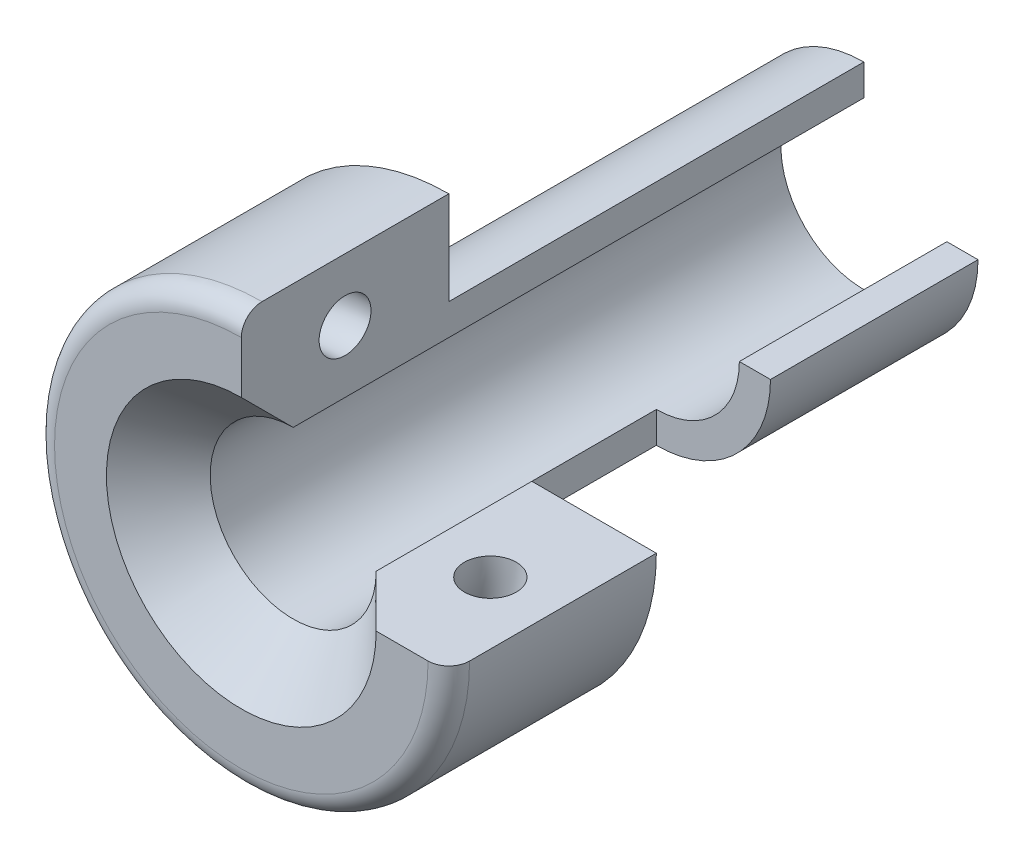
ISO-10303-21;
HEADER;
FILE_DESCRIPTION(('STEP AP214'),'2;1');
FILE_NAME('part.step','',(''),(''),'','','');
FILE_SCHEMA(('AUTOMOTIVE_DESIGN { 1 0 10303 214 1 1 1 1 }'));
ENDSEC;
DATA;
#1=APPLICATION_CONTEXT('core data for automotive mechanical design processes');
#2=APPLICATION_PROTOCOL_DEFINITION('international standard','automotive_design',2000,#1);
#3=PRODUCT_CONTEXT('',#1,'mechanical');
#4=PRODUCT('Part','Part','',(#3));
#5=PRODUCT_RELATED_PRODUCT_CATEGORY('part','',(#4));
#6=PRODUCT_DEFINITION_FORMATION('','',#4);
#7=PRODUCT_DEFINITION_CONTEXT('part definition',#1,'design');
#8=PRODUCT_DEFINITION('design','',#6,#7);
#9=PRODUCT_DEFINITION_SHAPE('','',#8);
#10=(LENGTH_UNIT() NAMED_UNIT(*) SI_UNIT(.MILLI.,.METRE.));
#11=(NAMED_UNIT(*) PLANE_ANGLE_UNIT() SI_UNIT($,.RADIAN.));
#12=(NAMED_UNIT(*) SI_UNIT($,.STERADIAN.) SOLID_ANGLE_UNIT());
#13=UNCERTAINTY_MEASURE_WITH_UNIT(LENGTH_MEASURE(1.E-05),#10,'distance_accuracy_value','');
#14=(GEOMETRIC_REPRESENTATION_CONTEXT(3) GLOBAL_UNCERTAINTY_ASSIGNED_CONTEXT((#13)) GLOBAL_UNIT_ASSIGNED_CONTEXT((#10,
#11,#12)) REPRESENTATION_CONTEXT('',''));
#15=CARTESIAN_POINT('',(0.,0.,0.));
#16=DIRECTION('',(0.,0.,1.));
#17=DIRECTION('',(1.,0.,0.));
#18=AXIS2_PLACEMENT_3D('',#15,#16,#17);
#19=CARTESIAN_POINT('',(0.,0.,-20.));
#20=DIRECTION('',(0.,0.,1.));
#21=DIRECTION('',(1.,0.,0.));
#22=AXIS2_PLACEMENT_3D('',#19,#20,#21);
#23=PLANE('',#22);
#24=CARTESIAN_POINT('',(0.,0.,-20.));
#25=DIRECTION('',(0.,0.,-1.));
#26=DIRECTION('',(-1.,0.,0.));
#27=AXIS2_PLACEMENT_3D('',#24,#25,#26);
#28=CIRCLE('',#27,11.);
#29=CARTESIAN_POINT('',(0.,-11.,-20.));
#30=VERTEX_POINT('',#29);
#31=CARTESIAN_POINT('',(0.,11.,-20.));
#32=VERTEX_POINT('',#31);
#33=EDGE_CURVE('E189',#30,#32,#28,.T.);
#34=ORIENTED_EDGE('',*,*,#33,.F.);
#35=DIRECTION('',(0.,1.,0.));
#36=VECTOR('',#35,1.);
#37=CARTESIAN_POINT('',(0.,0.,-20.));
#38=LINE('',#37,#36);
#39=CARTESIAN_POINT('',(0.,-8.,-20.));
#40=VERTEX_POINT('',#39);
#41=EDGE_CURVE('E184',#30,#40,#38,.T.);
#42=ORIENTED_EDGE('',*,*,#41,.T.);
#43=CARTESIAN_POINT('',(0.,0.,-20.));
#44=DIRECTION('',(0.,0.,-1.));
#45=DIRECTION('',(-1.,0.,0.));
#46=AXIS2_PLACEMENT_3D('',#43,#44,#45);
#47=CIRCLE('',#46,8.);
#48=CARTESIAN_POINT('',(8.,0.,-20.));
#49=VERTEX_POINT('',#48);
#50=EDGE_CURVE('E233',#49,#40,#47,.T.);
#51=ORIENTED_EDGE('',*,*,#50,.F.);
#52=DIRECTION('',(-1.,0.,0.));
#53=VECTOR('',#52,1.);
#54=CARTESIAN_POINT('',(0.,0.,-20.));
#55=LINE('',#54,#53);
#56=CARTESIAN_POINT('',(20.,2.09488880330588E-13,-20.));
#57=VERTEX_POINT('',#56);
#58=EDGE_CURVE('E224',#57,#49,#55,.T.);
#59=ORIENTED_EDGE('',*,*,#58,.F.);
#60=CARTESIAN_POINT('',(0.,0.,-20.));
#61=DIRECTION('',(0.,0.,-1.));
#62=DIRECTION('',(-1.,0.,0.));
#63=AXIS2_PLACEMENT_3D('',#60,#61,#62);
#64=CIRCLE('',#63,20.);
#65=CARTESIAN_POINT('',(0.,20.,-20.));
#66=VERTEX_POINT('',#65);
#67=EDGE_CURVE('E228',#57,#66,#64,.T.);
#68=ORIENTED_EDGE('',*,*,#67,.T.);
#69=DIRECTION('',(0.,-1.,0.));
#70=VECTOR('',#69,1.);
#71=CARTESIAN_POINT('',(0.,0.,-20.));
#72=LINE('',#71,#70);
#73=EDGE_CURVE('E206',#66,#32,#72,.T.);
#74=ORIENTED_EDGE('',*,*,#73,.T.);
#75=EDGE_LOOP('',(#34,#42,#51,#59,#68,#74));
#76=FACE_BOUND('',#75,.T.);
#77=ADVANCED_FACE('F48',(#76),#23,.F.);
#78=CARTESIAN_POINT('',(0.,0.,0.));
#79=DIRECTION('',(0.,0.,-1.));
#80=DIRECTION('',(-1.,0.,0.));
#81=AXIS2_PLACEMENT_3D('',#78,#79,#80);
#82=PLANE('',#81);
#83=DIRECTION('',(0.,1.,0.));
#84=VECTOR('',#83,1.);
#85=CARTESIAN_POINT('',(0.,0.,0.));
#86=LINE('',#85,#84);
#87=CARTESIAN_POINT('',(0.,13.,0.));
#88=VERTEX_POINT('',#87);
#89=CARTESIAN_POINT('',(0.,18.,0.));
#90=VERTEX_POINT('',#89);
#91=EDGE_CURVE('E199',#88,#90,#86,.T.);
#92=ORIENTED_EDGE('',*,*,#91,.T.);
#93=CARTESIAN_POINT('',(0.,0.,0.));
#94=DIRECTION('',(0.,0.,-1.));
#95=DIRECTION('',(-1.,0.,0.));
#96=AXIS2_PLACEMENT_3D('',#93,#94,#95);
#97=CIRCLE('',#96,18.);
#98=CARTESIAN_POINT('',(18.,1.88539992297529E-13,0.));
#99=VERTEX_POINT('',#98);
#100=EDGE_CURVE('E60',#90,#99,#97,.F.);
#101=ORIENTED_EDGE('',*,*,#100,.T.);
#102=DIRECTION('',(1.,0.,0.));
#103=VECTOR('',#102,1.);
#104=CARTESIAN_POINT('',(0.,0.,0.));
#105=LINE('',#104,#103);
#106=CARTESIAN_POINT('',(13.,1.36167772214882E-13,0.));
#107=VERTEX_POINT('',#106);
#108=EDGE_CURVE('E220',#107,#99,#105,.T.);
#109=ORIENTED_EDGE('',*,*,#108,.F.);
#110=CARTESIAN_POINT('',(0.,0.,0.));
#111=DIRECTION('',(0.,0.,-1.));
#112=DIRECTION('',(-1.,0.,0.));
#113=AXIS2_PLACEMENT_3D('',#110,#111,#112);
#114=CIRCLE('',#113,13.);
#115=EDGE_CURVE('E238',#107,#88,#114,.T.);
#116=ORIENTED_EDGE('',*,*,#115,.T.);
#117=EDGE_LOOP('',(#92,#101,#109,#116));
#118=FACE_BOUND('',#117,.T.);
#119=ADVANCED_FACE('F302',(#118),#82,.F.);
#120=CARTESIAN_POINT('',(0.,0.,0.));
#121=DIRECTION('',(0.,0.,-1.));
#122=DIRECTION('',(-1.,0.,0.));
#123=AXIS2_PLACEMENT_3D('',#120,#121,#122);
#124=CYLINDRICAL_SURFACE('',#123,8.);
#125=DIRECTION('',(0.,0.,-1.));
#126=VECTOR('',#125,1.);
#127=CARTESIAN_POINT('',(0.,8.,0.));
#128=LINE('',#127,#126);
#129=CARTESIAN_POINT('',(0.,8.,-5.00000000000001));
#130=VERTEX_POINT('',#129);
#131=CARTESIAN_POINT('',(0.,8.,-60.));
#132=VERTEX_POINT('',#131);
#133=EDGE_CURVE('E201',#130,#132,#128,.T.);
#134=ORIENTED_EDGE('',*,*,#133,.F.);
#135=CARTESIAN_POINT('',(0.,0.,-5.00000000000001));
#136=DIRECTION('',(0.,0.,-1.));
#137=DIRECTION('',(-1.,0.,0.));
#138=AXIS2_PLACEMENT_3D('',#135,#136,#137);
#139=CIRCLE('',#138,8.);
#140=CARTESIAN_POINT('',(8.,0.,-5.00000000000001));
#141=VERTEX_POINT('',#140);
#142=EDGE_CURVE('E249',#130,#141,#139,.F.);
#143=ORIENTED_EDGE('',*,*,#142,.T.);
#144=DIRECTION('',(0.,0.,-1.));
#145=VECTOR('',#144,1.);
#146=CARTESIAN_POINT('',(8.,0.,0.));
#147=LINE('',#146,#145);
#148=EDGE_CURVE('E219',#141,#49,#147,.T.);
#149=ORIENTED_EDGE('',*,*,#148,.T.);
#150=ORIENTED_EDGE('',*,*,#50,.T.);
#151=DIRECTION('',(0.,0.,-1.));
#152=VECTOR('',#151,1.);
#153=CARTESIAN_POINT('',(0.,-8.,0.));
#154=LINE('',#153,#152);
#155=CARTESIAN_POINT('',(0.,-8.,-40.));
#156=VERTEX_POINT('',#155);
#157=EDGE_CURVE('E177',#40,#156,#154,.T.);
#158=ORIENTED_EDGE('',*,*,#157,.T.);
#159=CARTESIAN_POINT('',(0.,0.,-40.));
#160=DIRECTION('',(0.,0.,-1.));
#161=DIRECTION('',(-1.,0.,0.));
#162=AXIS2_PLACEMENT_3D('',#159,#160,#161);
#163=CIRCLE('',#162,8.);
#164=CARTESIAN_POINT('',(8.,0.,-40.));
#165=VERTEX_POINT('',#164);
#166=EDGE_CURVE('E145',#165,#156,#163,.T.);
#167=ORIENTED_EDGE('',*,*,#166,.F.);
#168=DIRECTION('',(0.,0.,-1.));
#169=VECTOR('',#168,1.);
#170=CARTESIAN_POINT('',(8.,0.,0.));
#171=LINE('',#170,#169);
#172=CARTESIAN_POINT('',(8.,0.,-60.));
#173=VERTEX_POINT('',#172);
#174=EDGE_CURVE('E157',#165,#173,#171,.T.);
#175=ORIENTED_EDGE('',*,*,#174,.T.);
#176=CARTESIAN_POINT('',(0.,0.,-60.));
#177=DIRECTION('',(0.,0.,-1.));
#178=DIRECTION('',(-1.,0.,0.));
#179=AXIS2_PLACEMENT_3D('',#176,#177,#178);
#180=CIRCLE('',#179,8.);
#181=EDGE_CURVE('E194',#173,#132,#180,.T.);
#182=ORIENTED_EDGE('',*,*,#181,.T.);
#183=EDGE_LOOP('',(#134,#143,#149,#150,#158,#167,#175,#182));
#184=FACE_BOUND('',#183,.T.);
#185=ADVANCED_FACE('F294',(#184),#124,.F.);
#186=CARTESIAN_POINT('',(0.,0.,-10.));
#187=DIRECTION('',(0.,0.,-1.));
#188=DIRECTION('',(-1.,0.,0.));
#189=AXIS2_PLACEMENT_3D('',#186,#187,#188);
#190=TOROIDAL_SURFACE('',#189,14.,2.5);
#191=CARTESIAN_POINT('',(14.,1.46642216231412E-13,-10.));
#192=DIRECTION('',(0.,-1.,0.));
#193=DIRECTION('',(0.,0.,-1.));
#194=AXIS2_PLACEMENT_3D('',#191,#192,#193);
#195=CIRCLE('',#194,2.5);
#196=CARTESIAN_POINT('',(16.5,1.72828326272735E-13,-10.));
#197=VERTEX_POINT('',#196);
#198=EDGE_CURVE('E213',#197,#197,#195,.T.);
#199=CARTESIAN_POINT('',(0.,14.,-10.));
#200=DIRECTION('',(1.,0.,0.));
#201=DIRECTION('',(0.,0.,-1.));
#202=AXIS2_PLACEMENT_3D('',#199,#200,#201);
#203=CIRCLE('',#202,2.5);
#204=CARTESIAN_POINT('',(0.,16.5,-10.));
#205=VERTEX_POINT('',#204);
#206=EDGE_CURVE('E198',#205,#205,#203,.T.);
#207=CARTESIAN_POINT('',(0.,0.,-10.));
#208=DIRECTION('',(0.,0.,-1.));
#209=DIRECTION('',(-1.,0.,0.));
#210=AXIS2_PLACEMENT_3D('',#207,#208,#209);
#211=CIRCLE('',#210,16.5);
#212=EDGE_CURVE('',#197,#205,#211,.T.);
#213=ORIENTED_EDGE('',*,*,#198,.F.);
#214=ORIENTED_EDGE('',*,*,#206,.T.);
#215=ORIENTED_EDGE('',*,*,#212,.T.);
#216=ORIENTED_EDGE('',*,*,#212,.F.);
#217=EDGE_LOOP('',(#213,#215,#214,#216));
#218=FACE_BOUND('',#217,.T.);
#219=ADVANCED_FACE('F326',(#218),#190,.F.);
#220=CARTESIAN_POINT('',(0.,0.,0.));
#221=DIRECTION('',(0.,0.,-1.));
#222=DIRECTION('',(-1.,0.,0.));
#223=AXIS2_PLACEMENT_3D('',#220,#221,#222);
#224=CYLINDRICAL_SURFACE('',#223,20.);
#225=DIRECTION('',(0.,0.,-1.));
#226=VECTOR('',#225,1.);
#227=CARTESIAN_POINT('',(20.,2.09488880330588E-13,0.));
#228=LINE('',#227,#226);
#229=CARTESIAN_POINT('',(20.,2.09488880330588E-13,-2.));
#230=VERTEX_POINT('',#229);
#231=EDGE_CURVE('E229',#230,#57,#228,.T.);
#232=ORIENTED_EDGE('',*,*,#231,.F.);
#233=CARTESIAN_POINT('',(0.,0.,-2.));
#234=DIRECTION('',(0.,0.,-1.));
#235=DIRECTION('',(-1.,0.,0.));
#236=AXIS2_PLACEMENT_3D('',#233,#234,#235);
#237=CIRCLE('',#236,20.);
#238=CARTESIAN_POINT('',(0.,20.,-2.));
#239=VERTEX_POINT('',#238);
#240=EDGE_CURVE('E251',#230,#239,#237,.T.);
#241=ORIENTED_EDGE('',*,*,#240,.T.);
#242=DIRECTION('',(0.,0.,-1.));
#243=VECTOR('',#242,1.);
#244=CARTESIAN_POINT('',(0.,20.,0.));
#245=LINE('',#244,#243);
#246=EDGE_CURVE('E209',#239,#66,#245,.T.);
#247=ORIENTED_EDGE('',*,*,#246,.T.);
#248=ORIENTED_EDGE('',*,*,#67,.F.);
#249=EDGE_LOOP('',(#232,#241,#247,#248));
#250=FACE_BOUND('',#249,.T.);
#251=ADVANCED_FACE('F280',(#250),#224,.T.);
#252=CARTESIAN_POINT('',(0.,0.,0.));
#253=DIRECTION('',(0.,-1.,0.));
#254=DIRECTION('',(0.,0.,-1.));
#255=AXIS2_PLACEMENT_3D('',#252,#253,#254);
#256=PLANE('',#255);
#257=ORIENTED_EDGE('',*,*,#198,.T.);
#258=EDGE_LOOP('',(#257));
#259=FACE_BOUND('',#258,.T.);
#260=ORIENTED_EDGE('',*,*,#108,.T.);
#261=CARTESIAN_POINT('',(18.,1.88539992297529E-13,-2.));
#262=DIRECTION('',(0.,-1.,0.));
#263=DIRECTION('',(1.,0.,0.));
#264=AXIS2_PLACEMENT_3D('',#261,#262,#263);
#265=CIRCLE('',#264,2.);
#266=EDGE_CURVE('E11',#99,#230,#265,.F.);
#267=ORIENTED_EDGE('',*,*,#266,.T.);
#268=ORIENTED_EDGE('',*,*,#231,.T.);
#269=ORIENTED_EDGE('',*,*,#58,.T.);
#270=ORIENTED_EDGE('',*,*,#148,.F.);
#271=DIRECTION('',(0.707106781186546,0.,0.707106781186549));
#272=VECTOR('',#271,1.);
#273=CARTESIAN_POINT('',(0.,0.,-13.0000000000001));
#274=LINE('',#273,#272);
#275=EDGE_CURVE('E246',#141,#107,#274,.T.);
#276=ORIENTED_EDGE('',*,*,#275,.T.);
#277=EDGE_LOOP('',(#260,#267,#268,#269,#270,#276));
#278=FACE_BOUND('',#277,.T.);
#279=ADVANCED_FACE('F296',(#259,#278),#256,.F.);
#280=CARTESIAN_POINT('',(0.,0.,0.));
#281=DIRECTION('',(1.,0.,0.));
#282=DIRECTION('',(0.,0.,-1.));
#283=AXIS2_PLACEMENT_3D('',#280,#281,#282);
#284=PLANE('',#283);
#285=ORIENTED_EDGE('',*,*,#246,.F.);
#286=CARTESIAN_POINT('',(0.,18.,-2.));
#287=DIRECTION('',(1.,0.,0.));
#288=DIRECTION('',(0.,0.,-1.));
#289=AXIS2_PLACEMENT_3D('',#286,#287,#288);
#290=CIRCLE('',#289,2.);
#291=EDGE_CURVE('E72',#239,#90,#290,.T.);
#292=ORIENTED_EDGE('',*,*,#291,.T.);
#293=ORIENTED_EDGE('',*,*,#91,.F.);
#294=DIRECTION('',(0.,0.707106781186546,0.707106781186549));
#295=VECTOR('',#294,1.);
#296=CARTESIAN_POINT('',(0.,0.,-13.0000000000001));
#297=LINE('',#296,#295);
#298=EDGE_CURVE('E241',#88,#130,#297,.F.);
#299=ORIENTED_EDGE('',*,*,#298,.T.);
#300=ORIENTED_EDGE('',*,*,#133,.T.);
#301=DIRECTION('',(0.,1.,0.));
#302=VECTOR('',#301,1.);
#303=CARTESIAN_POINT('',(0.,0.,-60.));
#304=LINE('',#303,#302);
#305=CARTESIAN_POINT('',(0.,11.,-60.));
#306=VERTEX_POINT('',#305);
#307=EDGE_CURVE('E141',#132,#306,#304,.T.);
#308=ORIENTED_EDGE('',*,*,#307,.T.);
#309=DIRECTION('',(0.,0.,1.));
#310=VECTOR('',#309,1.);
#311=CARTESIAN_POINT('',(0.,11.,0.));
#312=LINE('',#311,#310);
#313=EDGE_CURVE('E171',#306,#32,#312,.T.);
#314=ORIENTED_EDGE('',*,*,#313,.T.);
#315=ORIENTED_EDGE('',*,*,#73,.F.);
#316=EDGE_LOOP('',(#285,#292,#293,#299,#300,#308,#314,#315));
#317=FACE_BOUND('',#316,.T.);
#318=ORIENTED_EDGE('',*,*,#206,.F.);
#319=EDGE_LOOP('',(#318));
#320=FACE_BOUND('',#319,.T.);
#321=ADVANCED_FACE('F284',(#317,#320),#284,.T.);
#322=CARTESIAN_POINT('',(0.,0.,-60.));
#323=DIRECTION('',(0.,0.,-1.));
#324=DIRECTION('',(-1.,0.,0.));
#325=AXIS2_PLACEMENT_3D('',#322,#323,#324);
#326=PLANE('',#325);
#327=CARTESIAN_POINT('',(0.,0.,-60.));
#328=DIRECTION('',(0.,0.,-1.));
#329=DIRECTION('',(-1.,0.,0.));
#330=AXIS2_PLACEMENT_3D('',#327,#328,#329);
#331=CIRCLE('',#330,11.);
#332=CARTESIAN_POINT('',(11.,1.15218884181823E-13,-60.));
#333=VERTEX_POINT('',#332);
#334=EDGE_CURVE('E151',#333,#306,#331,.T.);
#335=ORIENTED_EDGE('',*,*,#334,.T.);
#336=ORIENTED_EDGE('',*,*,#307,.F.);
#337=ORIENTED_EDGE('',*,*,#181,.F.);
#338=DIRECTION('',(1.,0.,0.));
#339=VECTOR('',#338,1.);
#340=CARTESIAN_POINT('',(0.,0.,-60.));
#341=LINE('',#340,#339);
#342=EDGE_CURVE('E163',#173,#333,#341,.T.);
#343=ORIENTED_EDGE('',*,*,#342,.T.);
#344=EDGE_LOOP('',(#335,#336,#337,#343));
#345=FACE_BOUND('',#344,.T.);
#346=ADVANCED_FACE('F308',(#345),#326,.T.);
#347=CARTESIAN_POINT('',(0.,0.,0.));
#348=DIRECTION('',(0.,0.,-1.));
#349=DIRECTION('',(-1.,0.,0.));
#350=AXIS2_PLACEMENT_3D('',#347,#348,#349);
#351=CYLINDRICAL_SURFACE('',#350,11.);
#352=ORIENTED_EDGE('',*,*,#33,.T.);
#353=ORIENTED_EDGE('',*,*,#313,.F.);
#354=ORIENTED_EDGE('',*,*,#334,.F.);
#355=DIRECTION('',(0.,0.,1.));
#356=VECTOR('',#355,1.);
#357=CARTESIAN_POINT('',(11.,1.15218884181823E-13,0.));
#358=LINE('',#357,#356);
#359=CARTESIAN_POINT('',(11.,1.15218884181823E-13,-40.));
#360=VERTEX_POINT('',#359);
#361=EDGE_CURVE('E150',#333,#360,#358,.T.);
#362=ORIENTED_EDGE('',*,*,#361,.T.);
#363=CARTESIAN_POINT('',(0.,0.,-40.));
#364=DIRECTION('',(0.,0.,-1.));
#365=DIRECTION('',(-1.,0.,0.));
#366=AXIS2_PLACEMENT_3D('',#363,#364,#365);
#367=CIRCLE('',#366,11.);
#368=CARTESIAN_POINT('',(0.,-11.,-40.));
#369=VERTEX_POINT('',#368);
#370=EDGE_CURVE('E134',#360,#369,#367,.T.);
#371=ORIENTED_EDGE('',*,*,#370,.T.);
#372=DIRECTION('',(0.,0.,1.));
#373=VECTOR('',#372,1.);
#374=CARTESIAN_POINT('',(0.,-11.,0.));
#375=LINE('',#374,#373);
#376=EDGE_CURVE('E182',#369,#30,#375,.T.);
#377=ORIENTED_EDGE('',*,*,#376,.T.);
#378=EDGE_LOOP('',(#352,#353,#354,#362,#371,#377));
#379=FACE_BOUND('',#378,.T.);
#380=ADVANCED_FACE('F149',(#379),#351,.T.);
#381=CARTESIAN_POINT('',(0.,0.,0.));
#382=DIRECTION('',(-1.,0.,0.));
#383=DIRECTION('',(0.,0.,-1.));
#384=AXIS2_PLACEMENT_3D('',#381,#382,#383);
#385=PLANE('',#384);
#386=ORIENTED_EDGE('',*,*,#376,.F.);
#387=DIRECTION('',(0.,1.,0.));
#388=VECTOR('',#387,1.);
#389=CARTESIAN_POINT('',(0.,0.,-40.));
#390=LINE('',#389,#388);
#391=EDGE_CURVE('E140',#369,#156,#390,.T.);
#392=ORIENTED_EDGE('',*,*,#391,.T.);
#393=ORIENTED_EDGE('',*,*,#157,.F.);
#394=ORIENTED_EDGE('',*,*,#41,.F.);
#395=EDGE_LOOP('',(#386,#392,#393,#394));
#396=FACE_BOUND('',#395,.T.);
#397=ADVANCED_FACE('F288',(#396),#385,.F.);
#398=CARTESIAN_POINT('',(0.,0.,-40.));
#399=DIRECTION('',(0.,0.,1.));
#400=DIRECTION('',(1.,0.,0.));
#401=AXIS2_PLACEMENT_3D('',#398,#399,#400);
#402=PLANE('',#401);
#403=ORIENTED_EDGE('',*,*,#391,.F.);
#404=ORIENTED_EDGE('',*,*,#370,.F.);
#405=DIRECTION('',(-1.,0.,0.));
#406=VECTOR('',#405,1.);
#407=CARTESIAN_POINT('',(0.,0.,-40.));
#408=LINE('',#407,#406);
#409=EDGE_CURVE('E138',#360,#165,#408,.T.);
#410=ORIENTED_EDGE('',*,*,#409,.T.);
#411=ORIENTED_EDGE('',*,*,#166,.T.);
#412=EDGE_LOOP('',(#403,#404,#410,#411));
#413=FACE_BOUND('',#412,.T.);
#414=ADVANCED_FACE('F131',(#413),#402,.T.);
#415=CARTESIAN_POINT('',(0.,0.,0.));
#416=DIRECTION('',(0.,-1.,0.));
#417=DIRECTION('',(0.,0.,-1.));
#418=AXIS2_PLACEMENT_3D('',#415,#416,#417);
#419=PLANE('',#418);
#420=ORIENTED_EDGE('',*,*,#361,.F.);
#421=ORIENTED_EDGE('',*,*,#342,.F.);
#422=ORIENTED_EDGE('',*,*,#174,.F.);
#423=ORIENTED_EDGE('',*,*,#409,.F.);
#424=EDGE_LOOP('',(#420,#421,#422,#423));
#425=FACE_BOUND('',#424,.T.);
#426=ADVANCED_FACE('F160',(#425),#419,.F.);
#427=CARTESIAN_POINT('',(0.,0.,0.));
#428=DIRECTION('',(0.,0.,1.));
#429=DIRECTION('',(1.,0.,0.));
#430=AXIS2_PLACEMENT_3D('',#427,#428,#429);
#431=CONICAL_SURFACE('',#430,13.,0.785398163397446);
#432=ORIENTED_EDGE('',*,*,#275,.F.);
#433=ORIENTED_EDGE('',*,*,#142,.F.);
#434=ORIENTED_EDGE('',*,*,#298,.F.);
#435=ORIENTED_EDGE('',*,*,#115,.F.);
#436=EDGE_LOOP('',(#432,#433,#434,#435));
#437=FACE_BOUND('',#436,.T.);
#438=ADVANCED_FACE('F304',(#437),#431,.F.);
#439=CARTESIAN_POINT('',(0.,0.,-2.));
#440=DIRECTION('',(0.,0.,-1.));
#441=DIRECTION('',(-1.,0.,0.));
#442=AXIS2_PLACEMENT_3D('',#439,#440,#441);
#443=TOROIDAL_SURFACE('',#442,18.,2.);
#444=ORIENTED_EDGE('',*,*,#266,.F.);
#445=ORIENTED_EDGE('',*,*,#100,.F.);
#446=ORIENTED_EDGE('',*,*,#291,.F.);
#447=ORIENTED_EDGE('',*,*,#240,.F.);
#448=EDGE_LOOP('',(#444,#445,#446,#447));
#449=FACE_BOUND('',#448,.T.);
#450=ADVANCED_FACE('F49',(#449),#443,.T.);
#451=CLOSED_SHELL('',(#77,#119,#185,#219,#251,#279,#321,#346,#380,#397,#414,#426,#438,#450));
#452=MANIFOLD_SOLID_BREP('B2',#451);
#453=ADVANCED_BREP_SHAPE_REPRESENTATION('',(#18,#452),#14);
#454=SHAPE_DEFINITION_REPRESENTATION(#9,#453);
ENDSEC;
END-ISO-10303-21;
